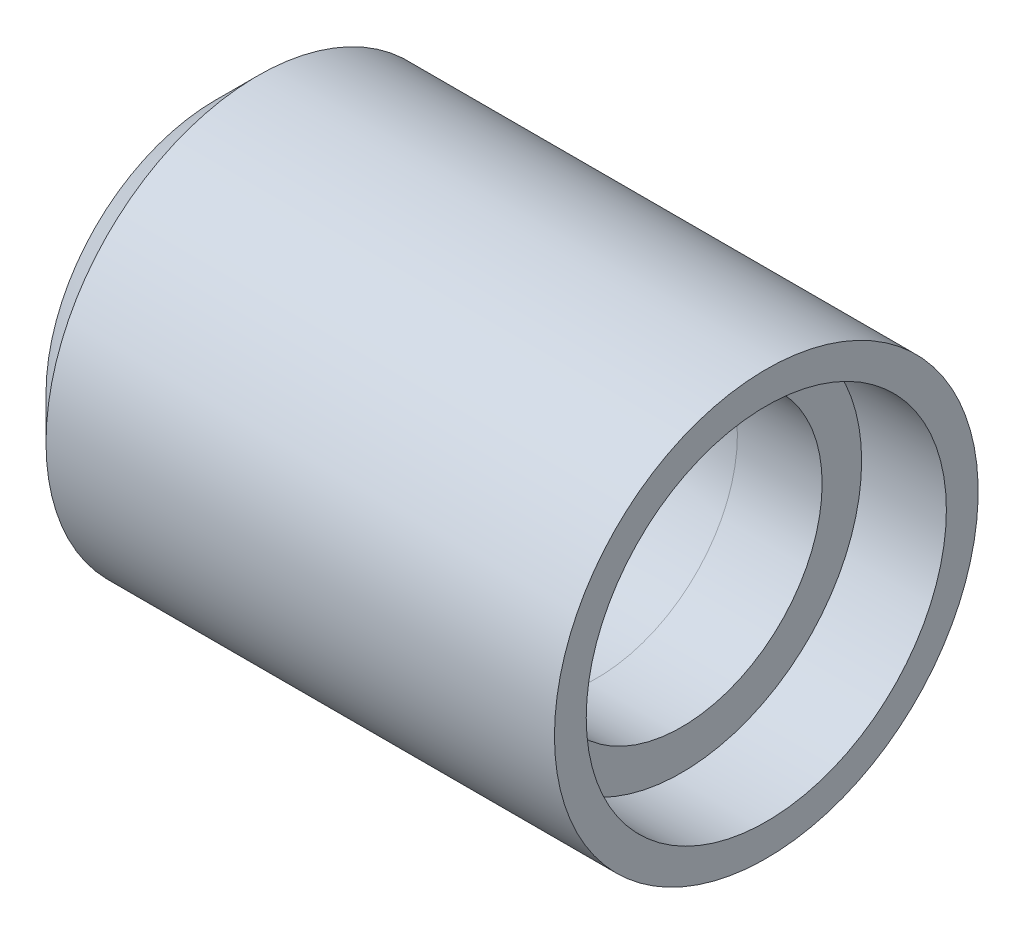
ISO-10303-21;
HEADER;
FILE_DESCRIPTION(('STEP AP214'),'2;1');
FILE_NAME('part.step','',(''),(''),'','','');
FILE_SCHEMA(('AUTOMOTIVE_DESIGN { 1 0 10303 214 1 1 1 1 }'));
ENDSEC;
DATA;
#1=APPLICATION_CONTEXT('core data for automotive mechanical design processes');
#2=APPLICATION_PROTOCOL_DEFINITION('international standard','automotive_design',2000,#1);
#3=PRODUCT_CONTEXT('',#1,'mechanical');
#4=PRODUCT('Part','Part','',(#3));
#5=PRODUCT_RELATED_PRODUCT_CATEGORY('part','',(#4));
#6=PRODUCT_DEFINITION_FORMATION('','',#4);
#7=PRODUCT_DEFINITION_CONTEXT('part definition',#1,'design');
#8=PRODUCT_DEFINITION('design','',#6,#7);
#9=PRODUCT_DEFINITION_SHAPE('','',#8);
#10=(LENGTH_UNIT() NAMED_UNIT(*) SI_UNIT(.MILLI.,.METRE.));
#11=(NAMED_UNIT(*) PLANE_ANGLE_UNIT() SI_UNIT($,.RADIAN.));
#12=(NAMED_UNIT(*) SI_UNIT($,.STERADIAN.) SOLID_ANGLE_UNIT());
#13=UNCERTAINTY_MEASURE_WITH_UNIT(LENGTH_MEASURE(1.E-05),#10,'distance_accuracy_value','');
#14=(GEOMETRIC_REPRESENTATION_CONTEXT(3) GLOBAL_UNCERTAINTY_ASSIGNED_CONTEXT((#13)) GLOBAL_UNIT_ASSIGNED_CONTEXT((#10,
#11,#12)) REPRESENTATION_CONTEXT('',''));
#15=CARTESIAN_POINT('',(0.,0.,0.));
#16=DIRECTION('',(0.,0.,1.));
#17=DIRECTION('',(1.,0.,0.));
#18=AXIS2_PLACEMENT_3D('',#15,#16,#17);
#19=CARTESIAN_POINT('',(0.5,3.5,0.));
#20=DIRECTION('',(1.,0.,0.));
#21=DIRECTION('',(0.,0.,-1.));
#22=AXIS2_PLACEMENT_3D('',#19,#20,#21);
#23=PLANE('',#22);
#24=CARTESIAN_POINT('',(0.5,0.,0.));
#25=DIRECTION('',(-1.,0.,0.));
#26=DIRECTION('',(0.,0.,1.));
#27=AXIS2_PLACEMENT_3D('',#24,#25,#26);
#28=CIRCLE('',#27,3.);
#29=CARTESIAN_POINT('',(0.5,0.,3.));
#30=VERTEX_POINT('',#29);
#31=EDGE_CURVE('E74',#30,#30,#28,.T.);
#32=ORIENTED_EDGE('',*,*,#31,.F.);
#33=EDGE_LOOP('',(#32));
#34=FACE_BOUND('',#33,.T.);
#35=CARTESIAN_POINT('',(0.499999999999999,0.,0.));
#36=DIRECTION('',(-1.,0.,0.));
#37=DIRECTION('',(0.,0.,1.));
#38=AXIS2_PLACEMENT_3D('',#35,#36,#37);
#39=CIRCLE('',#38,3.5);
#40=CARTESIAN_POINT('',(0.499999999999999,0.,3.5));
#41=VERTEX_POINT('',#40);
#42=EDGE_CURVE('E10',#41,#41,#39,.T.);
#43=ORIENTED_EDGE('',*,*,#42,.T.);
#44=EDGE_LOOP('',(#43));
#45=FACE_BOUND('',#44,.T.);
#46=ADVANCED_FACE('F34',(#34,#45),#23,.F.);
#47=CARTESIAN_POINT('',(0.,0.,0.));
#48=DIRECTION('',(-1.,0.,0.));
#49=DIRECTION('',(0.,0.,1.));
#50=AXIS2_PLACEMENT_3D('',#47,#48,#49);
#51=CYLINDRICAL_SURFACE('',#50,3.5);
#52=ORIENTED_EDGE('',*,*,#42,.F.);
#53=EDGE_LOOP('',(#52));
#54=FACE_BOUND('',#53,.T.);
#55=CARTESIAN_POINT('',(0.,0.,0.));
#56=DIRECTION('',(-1.,0.,0.));
#57=DIRECTION('',(0.,0.,1.));
#58=AXIS2_PLACEMENT_3D('',#55,#56,#57);
#59=CIRCLE('',#58,3.5);
#60=CARTESIAN_POINT('',(0.,0.,3.5));
#61=VERTEX_POINT('',#60);
#62=EDGE_CURVE('E40',#61,#61,#59,.T.);
#63=ORIENTED_EDGE('',*,*,#62,.T.);
#64=EDGE_LOOP('',(#63));
#65=FACE_BOUND('',#64,.T.);
#66=ADVANCED_FACE('F81',(#54,#65),#51,.F.);
#67=CARTESIAN_POINT('',(0.,3.5,0.));
#68=DIRECTION('',(1.,0.,0.));
#69=DIRECTION('',(0.,0.,-1.));
#70=AXIS2_PLACEMENT_3D('',#67,#68,#69);
#71=PLANE('',#70);
#72=ORIENTED_EDGE('',*,*,#62,.F.);
#73=EDGE_LOOP('',(#72));
#74=FACE_BOUND('',#73,.T.);
#75=CARTESIAN_POINT('',(0.,0.,0.));
#76=DIRECTION('',(-1.,0.,0.));
#77=DIRECTION('',(0.,0.,1.));
#78=AXIS2_PLACEMENT_3D('',#75,#76,#77);
#79=CIRCLE('',#78,4.);
#80=CARTESIAN_POINT('',(0.,0.,4.));
#81=VERTEX_POINT('',#80);
#82=EDGE_CURVE('E44',#81,#81,#79,.T.);
#83=ORIENTED_EDGE('',*,*,#82,.T.);
#84=EDGE_LOOP('',(#83));
#85=FACE_BOUND('',#84,.T.);
#86=ADVANCED_FACE('F85',(#74,#85),#71,.F.);
#87=CARTESIAN_POINT('',(1.,0.,0.));
#88=DIRECTION('',(1.,0.,0.));
#89=DIRECTION('',(0.,0.,-1.));
#90=AXIS2_PLACEMENT_3D('',#87,#88,#89);
#91=CONICAL_SURFACE('',#90,5.,0.785398163397447);
#92=ORIENTED_EDGE('',*,*,#82,.F.);
#93=EDGE_LOOP('',(#92));
#94=FACE_BOUND('',#93,.T.);
#95=CARTESIAN_POINT('',(1.,0.,0.));
#96=DIRECTION('',(-1.,0.,0.));
#97=DIRECTION('',(0.,0.,1.));
#98=AXIS2_PLACEMENT_3D('',#95,#96,#97);
#99=CIRCLE('',#98,5.);
#100=CARTESIAN_POINT('',(1.,0.,5.));
#101=VERTEX_POINT('',#100);
#102=EDGE_CURVE('E48',#101,#101,#99,.T.);
#103=ORIENTED_EDGE('',*,*,#102,.T.);
#104=EDGE_LOOP('',(#103));
#105=FACE_BOUND('',#104,.T.);
#106=ADVANCED_FACE('F90',(#94,#105),#91,.T.);
#107=CARTESIAN_POINT('',(0.,0.,0.));
#108=DIRECTION('',(-1.,0.,0.));
#109=DIRECTION('',(0.,0.,1.));
#110=AXIS2_PLACEMENT_3D('',#107,#108,#109);
#111=CYLINDRICAL_SURFACE('',#110,5.);
#112=ORIENTED_EDGE('',*,*,#102,.F.);
#113=EDGE_LOOP('',(#112));
#114=FACE_BOUND('',#113,.T.);
#115=CARTESIAN_POINT('',(13.,0.,0.));
#116=DIRECTION('',(-1.,0.,0.));
#117=DIRECTION('',(0.,0.,1.));
#118=AXIS2_PLACEMENT_3D('',#115,#116,#117);
#119=CIRCLE('',#118,5.);
#120=CARTESIAN_POINT('',(13.,0.,5.));
#121=VERTEX_POINT('',#120);
#122=EDGE_CURVE('E53',#121,#121,#119,.T.);
#123=ORIENTED_EDGE('',*,*,#122,.T.);
#124=EDGE_LOOP('',(#123));
#125=FACE_BOUND('',#124,.T.);
#126=ADVANCED_FACE('F96',(#114,#125),#111,.T.);
#127=CARTESIAN_POINT('',(13.,4.25,0.));
#128=DIRECTION('',(-1.,0.,0.));
#129=DIRECTION('',(0.,0.,1.));
#130=AXIS2_PLACEMENT_3D('',#127,#128,#129);
#131=PLANE('',#130);
#132=ORIENTED_EDGE('',*,*,#122,.F.);
#133=EDGE_LOOP('',(#132));
#134=FACE_BOUND('',#133,.T.);
#135=CARTESIAN_POINT('',(13.,0.,0.));
#136=DIRECTION('',(-1.,0.,0.));
#137=DIRECTION('',(0.,0.,1.));
#138=AXIS2_PLACEMENT_3D('',#135,#136,#137);
#139=CIRCLE('',#138,4.25);
#140=CARTESIAN_POINT('',(13.,0.,4.25));
#141=VERTEX_POINT('',#140);
#142=EDGE_CURVE('E56',#141,#141,#139,.T.);
#143=ORIENTED_EDGE('',*,*,#142,.T.);
#144=EDGE_LOOP('',(#143));
#145=FACE_BOUND('',#144,.T.);
#146=ADVANCED_FACE('F100',(#134,#145),#131,.F.);
#147=CARTESIAN_POINT('',(0.,0.,0.));
#148=DIRECTION('',(-1.,0.,0.));
#149=DIRECTION('',(0.,0.,1.));
#150=AXIS2_PLACEMENT_3D('',#147,#148,#149);
#151=CYLINDRICAL_SURFACE('',#150,4.25);
#152=ORIENTED_EDGE('',*,*,#142,.F.);
#153=EDGE_LOOP('',(#152));
#154=FACE_BOUND('',#153,.T.);
#155=CARTESIAN_POINT('',(11.,0.,0.));
#156=DIRECTION('',(-1.,0.,0.));
#157=DIRECTION('',(0.,0.,1.));
#158=AXIS2_PLACEMENT_3D('',#155,#156,#157);
#159=CIRCLE('',#158,4.25);
#160=CARTESIAN_POINT('',(11.,0.,4.25));
#161=VERTEX_POINT('',#160);
#162=EDGE_CURVE('E59',#161,#161,#159,.T.);
#163=ORIENTED_EDGE('',*,*,#162,.T.);
#164=EDGE_LOOP('',(#163));
#165=FACE_BOUND('',#164,.T.);
#166=ADVANCED_FACE('F104',(#154,#165),#151,.F.);
#167=CARTESIAN_POINT('',(11.,3.31758842449785,0.));
#168=DIRECTION('',(-1.,0.,0.));
#169=DIRECTION('',(0.,0.,1.));
#170=AXIS2_PLACEMENT_3D('',#167,#168,#169);
#171=PLANE('',#170);
#172=ORIENTED_EDGE('',*,*,#162,.F.);
#173=EDGE_LOOP('',(#172));
#174=FACE_BOUND('',#173,.T.);
#175=CARTESIAN_POINT('',(11.,0.,0.));
#176=DIRECTION('',(-1.,0.,0.));
#177=DIRECTION('',(0.,0.,1.));
#178=AXIS2_PLACEMENT_3D('',#175,#176,#177);
#179=CIRCLE('',#178,3.31758842449785);
#180=CARTESIAN_POINT('',(11.,0.,3.31758842449785));
#181=VERTEX_POINT('',#180);
#182=EDGE_CURVE('E62',#181,#181,#179,.T.);
#183=ORIENTED_EDGE('',*,*,#182,.T.);
#184=EDGE_LOOP('',(#183));
#185=FACE_BOUND('',#184,.T.);
#186=ADVANCED_FACE('F108',(#174,#185),#171,.F.);
#187=CARTESIAN_POINT('',(0.,0.,0.));
#188=DIRECTION('',(-1.,0.,0.));
#189=DIRECTION('',(0.,0.,1.));
#190=AXIS2_PLACEMENT_3D('',#187,#188,#189);
#191=CYLINDRICAL_SURFACE('',#190,3.31758842449785);
#192=ORIENTED_EDGE('',*,*,#182,.F.);
#193=EDGE_LOOP('',(#192));
#194=FACE_BOUND('',#193,.T.);
#195=CARTESIAN_POINT('',(9.,0.,0.));
#196=DIRECTION('',(-1.,0.,0.));
#197=DIRECTION('',(0.,0.,1.));
#198=AXIS2_PLACEMENT_3D('',#195,#196,#197);
#199=CIRCLE('',#198,3.31758842449785);
#200=CARTESIAN_POINT('',(9.,0.,3.31758842449785));
#201=VERTEX_POINT('',#200);
#202=EDGE_CURVE('E65',#201,#201,#199,.T.);
#203=ORIENTED_EDGE('',*,*,#202,.T.);
#204=EDGE_LOOP('',(#203));
#205=FACE_BOUND('',#204,.T.);
#206=ADVANCED_FACE('F112',(#194,#205),#191,.F.);
#207=CARTESIAN_POINT('',(1.2,0.,0.));
#208=DIRECTION('',(-1.,0.,0.));
#209=DIRECTION('',(0.,0.,1.));
#210=AXIS2_PLACEMENT_3D('',#207,#208,#209);
#211=CONICAL_SURFACE('',#210,4.,0.0872664625997096);
#212=ORIENTED_EDGE('',*,*,#202,.F.);
#213=EDGE_LOOP('',(#212));
#214=FACE_BOUND('',#213,.T.);
#215=CARTESIAN_POINT('',(1.2,0.,0.));
#216=DIRECTION('',(-1.,0.,0.));
#217=DIRECTION('',(0.,0.,1.));
#218=AXIS2_PLACEMENT_3D('',#215,#216,#217);
#219=CIRCLE('',#218,4.);
#220=CARTESIAN_POINT('',(1.2,0.,4.));
#221=VERTEX_POINT('',#220);
#222=EDGE_CURVE('E68',#221,#221,#219,.T.);
#223=ORIENTED_EDGE('',*,*,#222,.T.);
#224=EDGE_LOOP('',(#223));
#225=FACE_BOUND('',#224,.T.);
#226=ADVANCED_FACE('F116',(#214,#225),#211,.F.);
#227=CARTESIAN_POINT('',(1.2,4.,0.));
#228=DIRECTION('',(-1.,0.,0.));
#229=DIRECTION('',(0.,0.,1.));
#230=AXIS2_PLACEMENT_3D('',#227,#228,#229);
#231=PLANE('',#230);
#232=ORIENTED_EDGE('',*,*,#222,.F.);
#233=EDGE_LOOP('',(#232));
#234=FACE_BOUND('',#233,.T.);
#235=CARTESIAN_POINT('',(1.2,0.,0.));
#236=DIRECTION('',(-1.,0.,0.));
#237=DIRECTION('',(0.,0.,1.));
#238=AXIS2_PLACEMENT_3D('',#235,#236,#237);
#239=CIRCLE('',#238,3.);
#240=CARTESIAN_POINT('',(1.2,0.,3.));
#241=VERTEX_POINT('',#240);
#242=EDGE_CURVE('E71',#241,#241,#239,.T.);
#243=ORIENTED_EDGE('',*,*,#242,.T.);
#244=EDGE_LOOP('',(#243));
#245=FACE_BOUND('',#244,.T.);
#246=ADVANCED_FACE('F120',(#234,#245),#231,.F.);
#247=CARTESIAN_POINT('',(0.,0.,0.));
#248=DIRECTION('',(-1.,0.,0.));
#249=DIRECTION('',(0.,0.,1.));
#250=AXIS2_PLACEMENT_3D('',#247,#248,#249);
#251=CYLINDRICAL_SURFACE('',#250,3.);
#252=ORIENTED_EDGE('',*,*,#242,.F.);
#253=EDGE_LOOP('',(#252));
#254=FACE_BOUND('',#253,.T.);
#255=ORIENTED_EDGE('',*,*,#31,.T.);
#256=EDGE_LOOP('',(#255));
#257=FACE_BOUND('',#256,.T.);
#258=ADVANCED_FACE('F78',(#254,#257),#251,.F.);
#259=CLOSED_SHELL('',(#46,#66,#86,#106,#126,#146,#166,#186,#206,#226,#246,#258));
#260=MANIFOLD_SOLID_BREP('B2',#259);
#261=ADVANCED_BREP_SHAPE_REPRESENTATION('',(#18,#260),#14);
#262=SHAPE_DEFINITION_REPRESENTATION(#9,#261);
ENDSEC;
END-ISO-10303-21;
